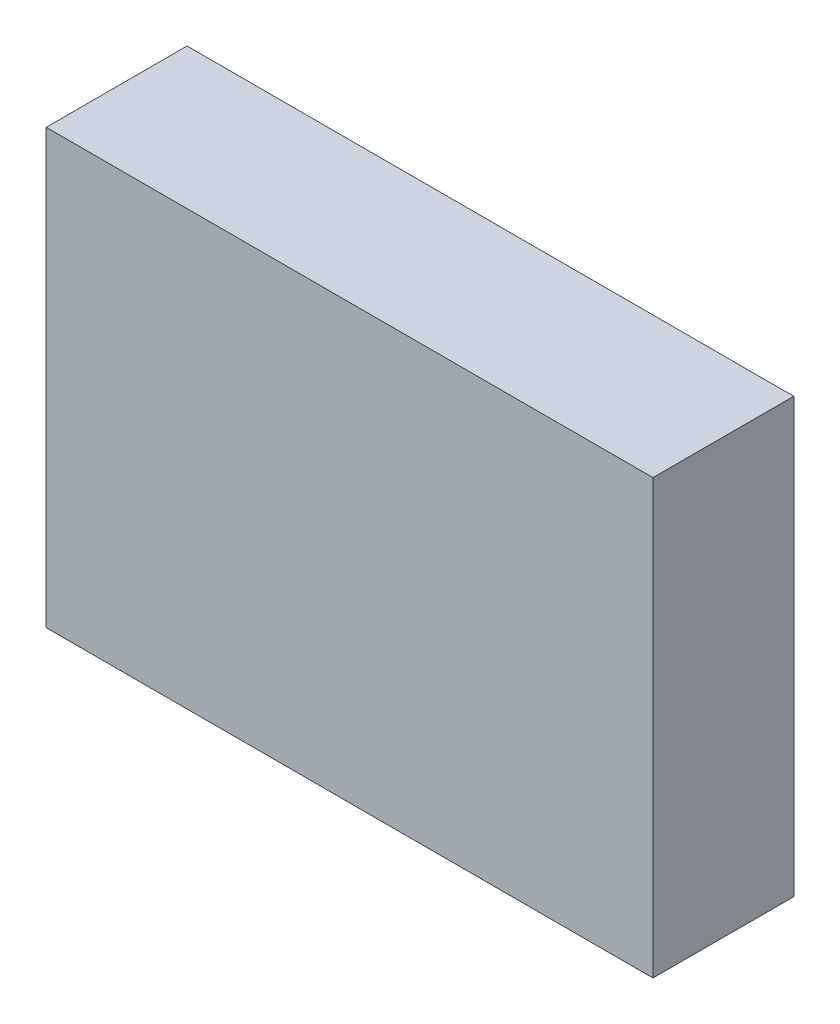
ISO-10303-21;
HEADER;
FILE_DESCRIPTION(('STEP AP214'),'2;1');
FILE_NAME('part.step','',(''),(''),'','','');
FILE_SCHEMA(('AUTOMOTIVE_DESIGN { 1 0 10303 214 1 1 1 1 }'));
ENDSEC;
DATA;
#1=APPLICATION_CONTEXT('core data for automotive mechanical design processes');
#2=APPLICATION_PROTOCOL_DEFINITION('international standard','automotive_design',2000,#1);
#3=PRODUCT_CONTEXT('',#1,'mechanical');
#4=PRODUCT('Part','Part','',(#3));
#5=PRODUCT_RELATED_PRODUCT_CATEGORY('part','',(#4));
#6=PRODUCT_DEFINITION_FORMATION('','',#4);
#7=PRODUCT_DEFINITION_CONTEXT('part definition',#1,'design');
#8=PRODUCT_DEFINITION('design','',#6,#7);
#9=PRODUCT_DEFINITION_SHAPE('','',#8);
#10=(LENGTH_UNIT() NAMED_UNIT(*) SI_UNIT(.MILLI.,.METRE.));
#11=(NAMED_UNIT(*) PLANE_ANGLE_UNIT() SI_UNIT($,.RADIAN.));
#12=(NAMED_UNIT(*) SI_UNIT($,.STERADIAN.) SOLID_ANGLE_UNIT());
#13=UNCERTAINTY_MEASURE_WITH_UNIT(LENGTH_MEASURE(1.E-05),#10,'distance_accuracy_value','');
#14=(GEOMETRIC_REPRESENTATION_CONTEXT(3) GLOBAL_UNCERTAINTY_ASSIGNED_CONTEXT((#13)) GLOBAL_UNIT_ASSIGNED_CONTEXT((#10,
#11,#12)) REPRESENTATION_CONTEXT('',''));
#15=CARTESIAN_POINT('',(0.,0.,0.));
#16=DIRECTION('',(0.,0.,1.));
#17=DIRECTION('',(1.,0.,0.));
#18=AXIS2_PLACEMENT_3D('',#15,#16,#17);
#19=CARTESIAN_POINT('',(-280.,200.,130.));
#20=DIRECTION('',(1.,0.,0.));
#21=DIRECTION('',(0.,1.,0.));
#22=AXIS2_PLACEMENT_3D('',#19,#20,#21);
#23=PLANE('',#22);
#24=DIRECTION('',(0.,-1.,0.));
#25=VECTOR('',#24,1.);
#26=CARTESIAN_POINT('',(-280.,200.,0.));
#27=LINE('',#26,#25);
#28=CARTESIAN_POINT('',(-280.,200.,0.));
#29=VERTEX_POINT('',#28);
#30=CARTESIAN_POINT('',(-280.,-200.,0.));
#31=VERTEX_POINT('',#30);
#32=EDGE_CURVE('E96',#29,#31,#27,.T.);
#33=ORIENTED_EDGE('',*,*,#32,.T.);
#34=DIRECTION('',(0.,0.,-1.));
#35=VECTOR('',#34,1.);
#36=CARTESIAN_POINT('',(-280.,-200.,130.));
#37=LINE('',#36,#35);
#38=CARTESIAN_POINT('',(-280.,-200.,130.));
#39=VERTEX_POINT('',#38);
#40=EDGE_CURVE('E11',#39,#31,#37,.T.);
#41=ORIENTED_EDGE('',*,*,#40,.F.);
#42=DIRECTION('',(0.,-1.,0.));
#43=VECTOR('',#42,1.);
#44=CARTESIAN_POINT('',(-280.,200.,130.));
#45=LINE('',#44,#43);
#46=CARTESIAN_POINT('',(-280.,200.,130.));
#47=VERTEX_POINT('',#46);
#48=EDGE_CURVE('E84',#47,#39,#45,.T.);
#49=ORIENTED_EDGE('',*,*,#48,.F.);
#50=DIRECTION('',(0.,0.,-1.));
#51=VECTOR('',#50,1.);
#52=CARTESIAN_POINT('',(-280.,200.,130.));
#53=LINE('',#52,#51);
#54=EDGE_CURVE('E92',#47,#29,#53,.T.);
#55=ORIENTED_EDGE('',*,*,#54,.T.);
#56=EDGE_LOOP('',(#33,#41,#49,#55));
#57=FACE_BOUND('',#56,.T.);
#58=ADVANCED_FACE('F33',(#57),#23,.F.);
#59=CARTESIAN_POINT('',(280.,-200.,130.));
#60=DIRECTION('',(0.,1.,0.));
#61=DIRECTION('',(-1.,0.,0.));
#62=AXIS2_PLACEMENT_3D('',#59,#60,#61);
#63=PLANE('',#62);
#64=DIRECTION('',(1.,0.,0.));
#65=VECTOR('',#64,1.);
#66=CARTESIAN_POINT('',(280.,-200.,0.));
#67=LINE('',#66,#65);
#68=CARTESIAN_POINT('',(280.,-200.,0.));
#69=VERTEX_POINT('',#68);
#70=EDGE_CURVE('E88',#31,#69,#67,.T.);
#71=ORIENTED_EDGE('',*,*,#70,.T.);
#72=DIRECTION('',(0.,0.,-1.));
#73=VECTOR('',#72,1.);
#74=CARTESIAN_POINT('',(280.,-200.,130.));
#75=LINE('',#74,#73);
#76=CARTESIAN_POINT('',(280.,-200.,130.));
#77=VERTEX_POINT('',#76);
#78=EDGE_CURVE('E41',#77,#69,#75,.T.);
#79=ORIENTED_EDGE('',*,*,#78,.F.);
#80=DIRECTION('',(1.,0.,0.));
#81=VECTOR('',#80,1.);
#82=CARTESIAN_POINT('',(280.,-200.,130.));
#83=LINE('',#82,#81);
#84=EDGE_CURVE('E79',#39,#77,#83,.T.);
#85=ORIENTED_EDGE('',*,*,#84,.F.);
#86=ORIENTED_EDGE('',*,*,#40,.T.);
#87=EDGE_LOOP('',(#71,#79,#85,#86));
#88=FACE_BOUND('',#87,.T.);
#89=ADVANCED_FACE('F87',(#88),#63,.F.);
#90=CARTESIAN_POINT('',(280.,200.,130.));
#91=DIRECTION('',(-1.,0.,0.));
#92=DIRECTION('',(0.,-1.,0.));
#93=AXIS2_PLACEMENT_3D('',#90,#91,#92);
#94=PLANE('',#93);
#95=DIRECTION('',(0.,1.,0.));
#96=VECTOR('',#95,1.);
#97=CARTESIAN_POINT('',(280.,200.,0.));
#98=LINE('',#97,#96);
#99=CARTESIAN_POINT('',(280.,200.,0.));
#100=VERTEX_POINT('',#99);
#101=EDGE_CURVE('E66',#69,#100,#98,.T.);
#102=ORIENTED_EDGE('',*,*,#101,.T.);
#103=DIRECTION('',(0.,0.,-1.));
#104=VECTOR('',#103,1.);
#105=CARTESIAN_POINT('',(280.,200.,130.));
#106=LINE('',#105,#104);
#107=CARTESIAN_POINT('',(280.,200.,130.));
#108=VERTEX_POINT('',#107);
#109=EDGE_CURVE('E89',#108,#100,#106,.T.);
#110=ORIENTED_EDGE('',*,*,#109,.F.);
#111=DIRECTION('',(0.,1.,0.));
#112=VECTOR('',#111,1.);
#113=CARTESIAN_POINT('',(280.,200.,130.));
#114=LINE('',#113,#112);
#115=EDGE_CURVE('E82',#77,#108,#114,.T.);
#116=ORIENTED_EDGE('',*,*,#115,.F.);
#117=ORIENTED_EDGE('',*,*,#78,.T.);
#118=EDGE_LOOP('',(#102,#110,#116,#117));
#119=FACE_BOUND('',#118,.T.);
#120=ADVANCED_FACE('F90',(#119),#94,.F.);
#121=CARTESIAN_POINT('',(280.,200.,130.));
#122=DIRECTION('',(0.,-1.,0.));
#123=DIRECTION('',(1.,0.,0.));
#124=AXIS2_PLACEMENT_3D('',#121,#122,#123);
#125=PLANE('',#124);
#126=DIRECTION('',(-1.,0.,0.));
#127=VECTOR('',#126,1.);
#128=CARTESIAN_POINT('',(280.,200.,0.));
#129=LINE('',#128,#127);
#130=EDGE_CURVE('E72',#100,#29,#129,.T.);
#131=ORIENTED_EDGE('',*,*,#130,.T.);
#132=ORIENTED_EDGE('',*,*,#54,.F.);
#133=DIRECTION('',(-1.,0.,0.));
#134=VECTOR('',#133,1.);
#135=CARTESIAN_POINT('',(280.,200.,130.));
#136=LINE('',#135,#134);
#137=EDGE_CURVE('E49',#108,#47,#136,.T.);
#138=ORIENTED_EDGE('',*,*,#137,.F.);
#139=ORIENTED_EDGE('',*,*,#109,.T.);
#140=EDGE_LOOP('',(#131,#132,#138,#139));
#141=FACE_BOUND('',#140,.T.);
#142=ADVANCED_FACE('F103',(#141),#125,.F.);
#143=CARTESIAN_POINT('',(0.,0.,130.));
#144=DIRECTION('',(0.,0.,-1.));
#145=DIRECTION('',(-1.,0.,0.));
#146=AXIS2_PLACEMENT_3D('',#143,#144,#145);
#147=PLANE('',#146);
#148=ORIENTED_EDGE('',*,*,#48,.T.);
#149=ORIENTED_EDGE('',*,*,#84,.T.);
#150=ORIENTED_EDGE('',*,*,#115,.T.);
#151=ORIENTED_EDGE('',*,*,#137,.T.);
#152=EDGE_LOOP('',(#148,#149,#150,#151));
#153=FACE_BOUND('',#152,.T.);
#154=ADVANCED_FACE('F80',(#153),#147,.F.);
#155=CARTESIAN_POINT('',(0.,0.,0.));
#156=DIRECTION('',(0.,0.,-1.));
#157=DIRECTION('',(-1.,0.,0.));
#158=AXIS2_PLACEMENT_3D('',#155,#156,#157);
#159=PLANE('',#158);
#160=ORIENTED_EDGE('',*,*,#32,.F.);
#161=ORIENTED_EDGE('',*,*,#130,.F.);
#162=ORIENTED_EDGE('',*,*,#101,.F.);
#163=ORIENTED_EDGE('',*,*,#70,.F.);
#164=EDGE_LOOP('',(#160,#161,#162,#163));
#165=FACE_BOUND('',#164,.T.);
#166=ADVANCED_FACE('F106',(#165),#159,.T.);
#167=CLOSED_SHELL('',(#58,#89,#120,#142,#154,#166));
#168=MANIFOLD_SOLID_BREP('B2',#167);
#169=ADVANCED_BREP_SHAPE_REPRESENTATION('',(#18,#168),#14);
#170=SHAPE_DEFINITION_REPRESENTATION(#9,#169);
ENDSEC;
END-ISO-10303-21;
